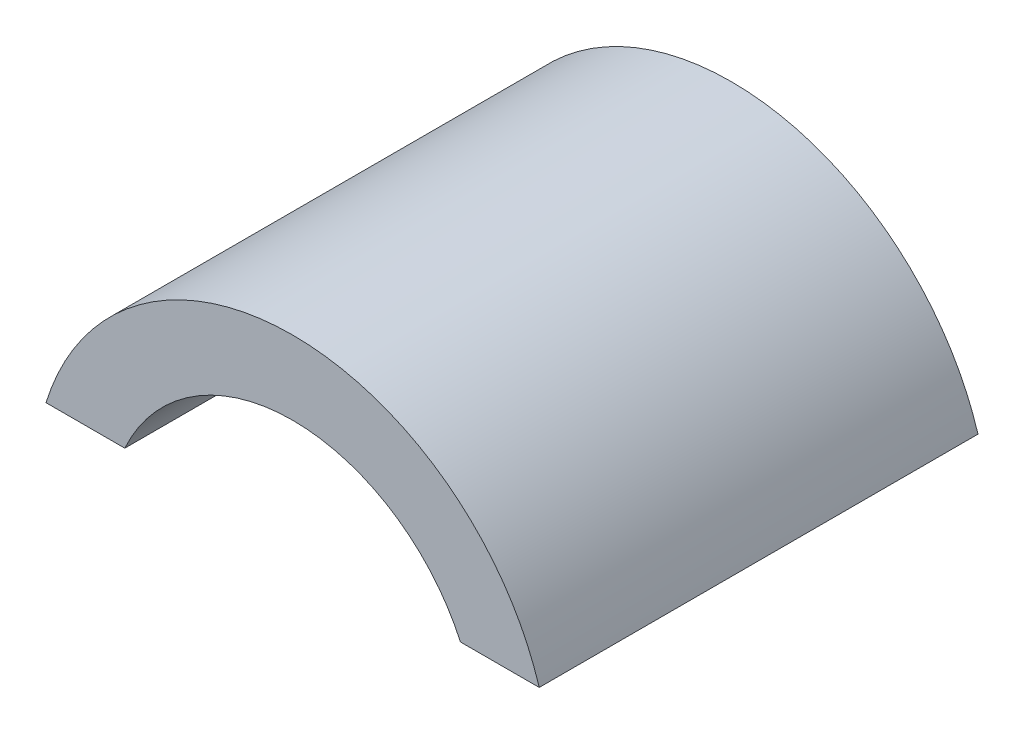
ISO-10303-21;
HEADER;
FILE_DESCRIPTION(('STEP AP214'),'2;1');
FILE_NAME('part.step','',(''),(''),'','','');
FILE_SCHEMA(('AUTOMOTIVE_DESIGN { 1 0 10303 214 1 1 1 1 }'));
ENDSEC;
DATA;
#1=APPLICATION_CONTEXT('core data for automotive mechanical design processes');
#2=APPLICATION_PROTOCOL_DEFINITION('international standard','automotive_design',2000,#1);
#3=PRODUCT_CONTEXT('',#1,'mechanical');
#4=PRODUCT('Part','Part','',(#3));
#5=PRODUCT_RELATED_PRODUCT_CATEGORY('part','',(#4));
#6=PRODUCT_DEFINITION_FORMATION('','',#4);
#7=PRODUCT_DEFINITION_CONTEXT('part definition',#1,'design');
#8=PRODUCT_DEFINITION('design','',#6,#7);
#9=PRODUCT_DEFINITION_SHAPE('','',#8);
#10=(LENGTH_UNIT() NAMED_UNIT(*) SI_UNIT(.MILLI.,.METRE.));
#11=(NAMED_UNIT(*) PLANE_ANGLE_UNIT() SI_UNIT($,.RADIAN.));
#12=(NAMED_UNIT(*) SI_UNIT($,.STERADIAN.) SOLID_ANGLE_UNIT());
#13=UNCERTAINTY_MEASURE_WITH_UNIT(LENGTH_MEASURE(1.E-05),#10,'distance_accuracy_value','');
#14=(GEOMETRIC_REPRESENTATION_CONTEXT(3) GLOBAL_UNCERTAINTY_ASSIGNED_CONTEXT((#13)) GLOBAL_UNIT_ASSIGNED_CONTEXT((#10,
#11,#12)) REPRESENTATION_CONTEXT('',''));
#15=CARTESIAN_POINT('',(0.,0.,0.));
#16=DIRECTION('',(0.,0.,1.));
#17=DIRECTION('',(1.,0.,0.));
#18=AXIS2_PLACEMENT_3D('',#15,#16,#17);
#19=CARTESIAN_POINT('',(-47.7944097065213,14.7521960919808,136.792271057495));
#20=DIRECTION('',(0.,1.,0.));
#21=DIRECTION('',(0.,0.,1.));
#22=AXIS2_PLACEMENT_3D('',#19,#20,#21);
#23=PLANE('',#22);
#24=DIRECTION('',(1.,0.,0.));
#25=VECTOR('',#24,1.);
#26=CARTESIAN_POINT('',(-47.7944097065213,14.7521960919808,86.7922710574948));
#27=LINE('',#26,#25);
#28=CARTESIAN_POINT('',(-47.7944097065213,14.7521960919808,86.7922710574948));
#29=VERTEX_POINT('',#28);
#30=CARTESIAN_POINT('',(-32.5299684754221,14.7521960919808,86.7922710574948));
#31=VERTEX_POINT('',#30);
#32=EDGE_CURVE('E11',#29,#31,#27,.T.);
#33=ORIENTED_EDGE('',*,*,#32,.T.);
#34=DIRECTION('',(0.,0.,-1.));
#35=VECTOR('',#34,1.);
#36=CARTESIAN_POINT('',(-32.5299684754221,14.7521960919808,136.792271057495));
#37=LINE('',#36,#35);
#38=CARTESIAN_POINT('',(-32.5299684754221,14.7521960919808,171.792271057495));
#39=VERTEX_POINT('',#38);
#40=EDGE_CURVE('E36',#39,#31,#37,.T.);
#41=ORIENTED_EDGE('',*,*,#40,.F.);
#42=DIRECTION('',(1.,0.,0.));
#43=VECTOR('',#42,1.);
#44=CARTESIAN_POINT('',(-47.7944097065213,14.7521960919808,171.792271057495));
#45=LINE('',#44,#43);
#46=CARTESIAN_POINT('',(-47.7944097065213,14.7521960919808,171.792271057495));
#47=VERTEX_POINT('',#46);
#48=EDGE_CURVE('E73',#47,#39,#45,.T.);
#49=ORIENTED_EDGE('',*,*,#48,.F.);
#50=DIRECTION('',(0.,0.,-1.));
#51=VECTOR('',#50,1.);
#52=CARTESIAN_POINT('',(-47.7944097065213,14.7521960919808,136.792271057495));
#53=LINE('',#52,#51);
#54=EDGE_CURVE('E27',#47,#29,#53,.T.);
#55=ORIENTED_EDGE('',*,*,#54,.T.);
#56=EDGE_LOOP('',(#33,#41,#49,#55));
#57=FACE_BOUND('',#56,.T.);
#58=ADVANCED_FACE('F17',(#57),#23,.F.);
#59=CARTESIAN_POINT('',(-0.0195470693560484,0.0021960919807713,136.792271057495));
#60=DIRECTION('',(0.,0.,-1.));
#61=DIRECTION('',(0.,1.,0.));
#62=AXIS2_PLACEMENT_3D('',#59,#60,#61);
#63=CYLINDRICAL_SURFACE('',#62,35.7);
#64=CARTESIAN_POINT('',(-0.0195470693560484,0.0021960919807713,86.7922710574948));
#65=DIRECTION('',(0.,0.,-1.));
#66=DIRECTION('',(0.,-1.,0.));
#67=AXIS2_PLACEMENT_3D('',#64,#65,#66);
#68=CIRCLE('',#67,35.7);
#69=CARTESIAN_POINT('',(32.4908743367274,14.7521960919426,86.7922710574948));
#70=VERTEX_POINT('',#69);
#71=EDGE_CURVE('E80',#31,#70,#68,.T.);
#72=ORIENTED_EDGE('',*,*,#71,.T.);
#73=DIRECTION('',(0.,0.,-1.));
#74=VECTOR('',#73,1.);
#75=CARTESIAN_POINT('',(32.4908743367274,14.7521960919426,136.792271057495));
#76=LINE('',#75,#74);
#77=CARTESIAN_POINT('',(32.4908743367274,14.7521960919426,171.792271057495));
#78=VERTEX_POINT('',#77);
#79=EDGE_CURVE('E86',#78,#70,#76,.T.);
#80=ORIENTED_EDGE('',*,*,#79,.F.);
#81=CARTESIAN_POINT('',(-0.0195470693560484,0.0021960919807713,171.792271057495));
#82=DIRECTION('',(0.,0.,-1.));
#83=DIRECTION('',(0.,-1.,0.));
#84=AXIS2_PLACEMENT_3D('',#81,#82,#83);
#85=CIRCLE('',#84,35.7);
#86=EDGE_CURVE('E64',#39,#78,#85,.T.);
#87=ORIENTED_EDGE('',*,*,#86,.F.);
#88=ORIENTED_EDGE('',*,*,#40,.T.);
#89=EDGE_LOOP('',(#72,#80,#87,#88));
#90=FACE_BOUND('',#89,.T.);
#91=ADVANCED_FACE('F90',(#90),#63,.F.);
#92=CARTESIAN_POINT('',(32.49087433671,14.7521960919808,136.792271057495));
#93=DIRECTION('',(0.,1.,0.));
#94=DIRECTION('',(0.,0.,1.));
#95=AXIS2_PLACEMENT_3D('',#92,#93,#94);
#96=PLANE('',#95);
#97=DIRECTION('',(1.,0.,0.));
#98=VECTOR('',#97,1.);
#99=CARTESIAN_POINT('',(32.49087433671,14.7521960919808,86.7922710574948));
#100=LINE('',#99,#98);
#101=CARTESIAN_POINT('',(47.7553155678092,14.7521960919808,86.7922710574948));
#102=VERTEX_POINT('',#101);
#103=EDGE_CURVE('E70',#70,#102,#100,.T.);
#104=ORIENTED_EDGE('',*,*,#103,.T.);
#105=DIRECTION('',(0.,0.,-1.));
#106=VECTOR('',#105,1.);
#107=CARTESIAN_POINT('',(47.7553155678092,14.7521960919808,136.792271057495));
#108=LINE('',#107,#106);
#109=CARTESIAN_POINT('',(47.7553155678092,14.7521960919808,171.792271057495));
#110=VERTEX_POINT('',#109);
#111=EDGE_CURVE('E56',#110,#102,#108,.T.);
#112=ORIENTED_EDGE('',*,*,#111,.F.);
#113=DIRECTION('',(1.,0.,0.));
#114=VECTOR('',#113,1.);
#115=CARTESIAN_POINT('',(32.49087433671,14.7521960919808,171.792271057495));
#116=LINE('',#115,#114);
#117=EDGE_CURVE('E62',#78,#110,#116,.T.);
#118=ORIENTED_EDGE('',*,*,#117,.F.);
#119=ORIENTED_EDGE('',*,*,#79,.T.);
#120=EDGE_LOOP('',(#104,#112,#118,#119));
#121=FACE_BOUND('',#120,.T.);
#122=ADVANCED_FACE('F68',(#121),#96,.F.);
#123=CARTESIAN_POINT('',(-0.0195470693560484,0.0021960919807713,136.792271057495));
#124=DIRECTION('',(0.,0.,-1.));
#125=DIRECTION('',(0.,1.,0.));
#126=AXIS2_PLACEMENT_3D('',#123,#124,#125);
#127=CYLINDRICAL_SURFACE('',#126,50.);
#128=CARTESIAN_POINT('',(-0.0195470693560484,0.0021960919807713,86.7922710574948));
#129=DIRECTION('',(0.,0.,1.));
#130=DIRECTION('',(0.,-1.,0.));
#131=AXIS2_PLACEMENT_3D('',#128,#129,#130);
#132=CIRCLE('',#131,50.);
#133=EDGE_CURVE('E72',#102,#29,#132,.T.);
#134=ORIENTED_EDGE('',*,*,#133,.T.);
#135=ORIENTED_EDGE('',*,*,#54,.F.);
#136=CARTESIAN_POINT('',(-0.0195470693560484,0.0021960919807713,171.792271057495));
#137=DIRECTION('',(0.,0.,1.));
#138=DIRECTION('',(0.,-1.,0.));
#139=AXIS2_PLACEMENT_3D('',#136,#137,#138);
#140=CIRCLE('',#139,50.);
#141=EDGE_CURVE('E21',#110,#47,#140,.T.);
#142=ORIENTED_EDGE('',*,*,#141,.F.);
#143=ORIENTED_EDGE('',*,*,#111,.T.);
#144=EDGE_LOOP('',(#134,#135,#142,#143));
#145=FACE_BOUND('',#144,.T.);
#146=ADVANCED_FACE('F76',(#145),#127,.T.);
#147=CARTESIAN_POINT('',(-0.0195470693560484,0.0021960919807713,171.792271057495));
#148=DIRECTION('',(0.,0.,-1.));
#149=DIRECTION('',(0.,1.,0.));
#150=AXIS2_PLACEMENT_3D('',#147,#148,#149);
#151=PLANE('',#150);
#152=ORIENTED_EDGE('',*,*,#48,.T.);
#153=ORIENTED_EDGE('',*,*,#86,.T.);
#154=ORIENTED_EDGE('',*,*,#117,.T.);
#155=ORIENTED_EDGE('',*,*,#141,.T.);
#156=EDGE_LOOP('',(#152,#153,#154,#155));
#157=FACE_BOUND('',#156,.T.);
#158=ADVANCED_FACE('F63',(#157),#151,.F.);
#159=CARTESIAN_POINT('',(-0.0195470693560484,0.0021960919807713,86.7922710574948));
#160=DIRECTION('',(0.,0.,-1.));
#161=DIRECTION('',(0.,1.,0.));
#162=AXIS2_PLACEMENT_3D('',#159,#160,#161);
#163=PLANE('',#162);
#164=ORIENTED_EDGE('',*,*,#32,.F.);
#165=ORIENTED_EDGE('',*,*,#133,.F.);
#166=ORIENTED_EDGE('',*,*,#103,.F.);
#167=ORIENTED_EDGE('',*,*,#71,.F.);
#168=EDGE_LOOP('',(#164,#165,#166,#167));
#169=FACE_BOUND('',#168,.T.);
#170=ADVANCED_FACE('F19',(#169),#163,.T.);
#171=CLOSED_SHELL('',(#58,#91,#122,#146,#158,#170));
#172=MANIFOLD_SOLID_BREP('B1',#171);
#173=ADVANCED_BREP_SHAPE_REPRESENTATION('',(#18,#172),#14);
#174=SHAPE_DEFINITION_REPRESENTATION(#9,#173);
ENDSEC;
END-ISO-10303-21;
